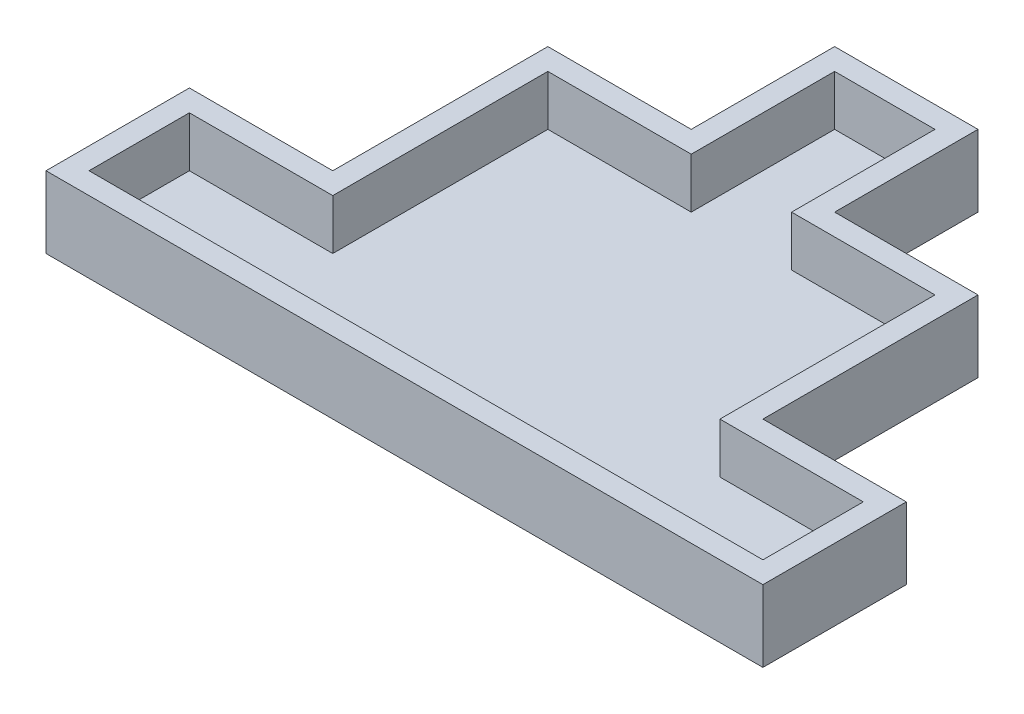
ISO-10303-21;
HEADER;
FILE_DESCRIPTION(('STEP AP214'),'2;1');
FILE_NAME('part.step','',(''),(''),'','','');
FILE_SCHEMA(('AUTOMOTIVE_DESIGN { 1 0 10303 214 1 1 1 1 }'));
ENDSEC;
DATA;
#1=APPLICATION_CONTEXT('core data for automotive mechanical design processes');
#2=APPLICATION_PROTOCOL_DEFINITION('international standard','automotive_design',2000,#1);
#3=PRODUCT_CONTEXT('',#1,'mechanical');
#4=PRODUCT('Part','Part','',(#3));
#5=PRODUCT_RELATED_PRODUCT_CATEGORY('part','',(#4));
#6=PRODUCT_DEFINITION_FORMATION('','',#4);
#7=PRODUCT_DEFINITION_CONTEXT('part definition',#1,'design');
#8=PRODUCT_DEFINITION('design','',#6,#7);
#9=PRODUCT_DEFINITION_SHAPE('','',#8);
#10=(LENGTH_UNIT() NAMED_UNIT(*) SI_UNIT(.MILLI.,.METRE.));
#11=(NAMED_UNIT(*) PLANE_ANGLE_UNIT() SI_UNIT($,.RADIAN.));
#12=(NAMED_UNIT(*) SI_UNIT($,.STERADIAN.) SOLID_ANGLE_UNIT());
#13=UNCERTAINTY_MEASURE_WITH_UNIT(LENGTH_MEASURE(1.E-05),#10,'distance_accuracy_value','');
#14=(GEOMETRIC_REPRESENTATION_CONTEXT(3) GLOBAL_UNCERTAINTY_ASSIGNED_CONTEXT((#13)) GLOBAL_UNIT_ASSIGNED_CONTEXT((#10,
#11,#12)) REPRESENTATION_CONTEXT('',''));
#15=CARTESIAN_POINT('',(0.,0.,0.));
#16=DIRECTION('',(0.,0.,1.));
#17=DIRECTION('',(1.,0.,0.));
#18=AXIS2_PLACEMENT_3D('',#15,#16,#17);
#19=CARTESIAN_POINT('',(0.,15.,0.));
#20=DIRECTION('',(0.,-1.,0.));
#21=DIRECTION('',(0.,0.,-1.));
#22=AXIS2_PLACEMENT_3D('',#19,#20,#21);
#23=PLANE('',#22);
#24=DIRECTION('',(-1.,0.,0.));
#25=VECTOR('',#24,1.);
#26=CARTESIAN_POINT('',(45.,15.,-75.));
#27=LINE('',#26,#25);
#28=CARTESIAN_POINT('',(45.,15.,-75.));
#29=VERTEX_POINT('',#28);
#30=CARTESIAN_POINT('',(15.,15.,-75.));
#31=VERTEX_POINT('',#30);
#32=EDGE_CURVE('E193',#29,#31,#27,.T.);
#33=ORIENTED_EDGE('',*,*,#32,.T.);
#34=DIRECTION('',(0.,0.,-1.));
#35=VECTOR('',#34,1.);
#36=CARTESIAN_POINT('',(15.,15.,-75.));
#37=LINE('',#36,#35);
#38=CARTESIAN_POINT('',(15.,15.,-105.));
#39=VERTEX_POINT('',#38);
#40=EDGE_CURVE('E114',#31,#39,#37,.T.);
#41=ORIENTED_EDGE('',*,*,#40,.T.);
#42=DIRECTION('',(-1.,0.,0.));
#43=VECTOR('',#42,1.);
#44=CARTESIAN_POINT('',(-15.,15.,-105.));
#45=LINE('',#44,#43);
#46=CARTESIAN_POINT('',(-15.,15.,-105.));
#47=VERTEX_POINT('',#46);
#48=EDGE_CURVE('E220',#39,#47,#45,.T.);
#49=ORIENTED_EDGE('',*,*,#48,.T.);
#50=DIRECTION('',(0.,0.,1.));
#51=VECTOR('',#50,1.);
#52=CARTESIAN_POINT('',(-15.,15.,-75.));
#53=LINE('',#52,#51);
#54=CARTESIAN_POINT('',(-15.,15.,-75.));
#55=VERTEX_POINT('',#54);
#56=EDGE_CURVE('E238',#47,#55,#53,.T.);
#57=ORIENTED_EDGE('',*,*,#56,.T.);
#58=DIRECTION('',(-1.,0.,0.));
#59=VECTOR('',#58,1.);
#60=CARTESIAN_POINT('',(-45.,15.,-75.));
#61=LINE('',#60,#59);
#62=CARTESIAN_POINT('',(-45.,15.,-75.));
#63=VERTEX_POINT('',#62);
#64=EDGE_CURVE('E235',#55,#63,#61,.T.);
#65=ORIENTED_EDGE('',*,*,#64,.T.);
#66=DIRECTION('',(0.,0.,1.));
#67=VECTOR('',#66,1.);
#68=CARTESIAN_POINT('',(-45.,15.,-30.));
#69=LINE('',#68,#67);
#70=CARTESIAN_POINT('',(-45.,15.,-30.));
#71=VERTEX_POINT('',#70);
#72=EDGE_CURVE('E237',#63,#71,#69,.T.);
#73=ORIENTED_EDGE('',*,*,#72,.T.);
#74=DIRECTION('',(-1.,0.,0.));
#75=VECTOR('',#74,1.);
#76=CARTESIAN_POINT('',(-75.,15.,-30.));
#77=LINE('',#76,#75);
#78=CARTESIAN_POINT('',(-75.,15.,-30.));
#79=VERTEX_POINT('',#78);
#80=EDGE_CURVE('E240',#71,#79,#77,.T.);
#81=ORIENTED_EDGE('',*,*,#80,.T.);
#82=DIRECTION('',(0.,0.,1.));
#83=VECTOR('',#82,1.);
#84=CARTESIAN_POINT('',(-75.,15.,0.));
#85=LINE('',#84,#83);
#86=CARTESIAN_POINT('',(-75.,15.,0.));
#87=VERTEX_POINT('',#86);
#88=EDGE_CURVE('E246',#79,#87,#85,.T.);
#89=ORIENTED_EDGE('',*,*,#88,.T.);
#90=DIRECTION('',(1.,0.,0.));
#91=VECTOR('',#90,1.);
#92=CARTESIAN_POINT('',(75.,15.,0.));
#93=LINE('',#92,#91);
#94=CARTESIAN_POINT('',(75.,15.,0.));
#95=VERTEX_POINT('',#94);
#96=EDGE_CURVE('E148',#87,#95,#93,.T.);
#97=ORIENTED_EDGE('',*,*,#96,.T.);
#98=DIRECTION('',(0.,0.,-1.));
#99=VECTOR('',#98,1.);
#100=CARTESIAN_POINT('',(75.,15.,0.));
#101=LINE('',#100,#99);
#102=CARTESIAN_POINT('',(75.,15.,-30.));
#103=VERTEX_POINT('',#102);
#104=EDGE_CURVE('E141',#95,#103,#101,.T.);
#105=ORIENTED_EDGE('',*,*,#104,.T.);
#106=DIRECTION('',(-1.,0.,0.));
#107=VECTOR('',#106,1.);
#108=CARTESIAN_POINT('',(75.,15.,-30.));
#109=LINE('',#108,#107);
#110=CARTESIAN_POINT('',(45.,15.,-30.));
#111=VERTEX_POINT('',#110);
#112=EDGE_CURVE('E145',#103,#111,#109,.T.);
#113=ORIENTED_EDGE('',*,*,#112,.T.);
#114=DIRECTION('',(0.,0.,-1.));
#115=VECTOR('',#114,1.);
#116=CARTESIAN_POINT('',(45.,15.,-30.));
#117=LINE('',#116,#115);
#118=EDGE_CURVE('E61',#111,#29,#117,.T.);
#119=ORIENTED_EDGE('',*,*,#118,.T.);
#120=EDGE_LOOP('',(#33,#41,#49,#57,#65,#73,#81,#89,#97,#105,#113,#119));
#121=FACE_BOUND('',#120,.T.);
#122=DIRECTION('',(-1.,0.,0.));
#123=VECTOR('',#122,1.);
#124=CARTESIAN_POINT('',(0.,15.,-70.5));
#125=LINE('',#124,#123);
#126=CARTESIAN_POINT('',(40.5,15.,-70.5));
#127=VERTEX_POINT('',#126);
#128=CARTESIAN_POINT('',(10.5,15.,-70.5));
#129=VERTEX_POINT('',#128);
#130=EDGE_CURVE('E296',#127,#129,#125,.T.);
#131=ORIENTED_EDGE('',*,*,#130,.F.);
#132=DIRECTION('',(0.,0.,-1.));
#133=VECTOR('',#132,1.);
#134=CARTESIAN_POINT('',(40.5,15.,0.));
#135=LINE('',#134,#133);
#136=CARTESIAN_POINT('',(40.5,15.,-25.5));
#137=VERTEX_POINT('',#136);
#138=EDGE_CURVE('E264',#137,#127,#135,.T.);
#139=ORIENTED_EDGE('',*,*,#138,.F.);
#140=DIRECTION('',(-1.,0.,0.));
#141=VECTOR('',#140,1.);
#142=CARTESIAN_POINT('',(0.,15.,-25.5));
#143=LINE('',#142,#141);
#144=CARTESIAN_POINT('',(70.5,15.,-25.5));
#145=VERTEX_POINT('',#144);
#146=EDGE_CURVE('E267',#145,#137,#143,.T.);
#147=ORIENTED_EDGE('',*,*,#146,.F.);
#148=DIRECTION('',(0.,0.,-1.));
#149=VECTOR('',#148,1.);
#150=CARTESIAN_POINT('',(70.5,15.,0.));
#151=LINE('',#150,#149);
#152=CARTESIAN_POINT('',(70.5,15.,-4.5));
#153=VERTEX_POINT('',#152);
#154=EDGE_CURVE('E269',#153,#145,#151,.T.);
#155=ORIENTED_EDGE('',*,*,#154,.F.);
#156=DIRECTION('',(1.,0.,0.));
#157=VECTOR('',#156,1.);
#158=CARTESIAN_POINT('',(0.,15.,-4.5));
#159=LINE('',#158,#157);
#160=CARTESIAN_POINT('',(-70.5,15.,-4.5));
#161=VERTEX_POINT('',#160);
#162=EDGE_CURVE('E272',#161,#153,#159,.T.);
#163=ORIENTED_EDGE('',*,*,#162,.F.);
#164=DIRECTION('',(0.,0.,1.));
#165=VECTOR('',#164,1.);
#166=CARTESIAN_POINT('',(-70.5,15.,0.));
#167=LINE('',#166,#165);
#168=CARTESIAN_POINT('',(-70.5,15.,-25.5));
#169=VERTEX_POINT('',#168);
#170=EDGE_CURVE('E275',#169,#161,#167,.T.);
#171=ORIENTED_EDGE('',*,*,#170,.F.);
#172=DIRECTION('',(-1.,0.,0.));
#173=VECTOR('',#172,1.);
#174=CARTESIAN_POINT('',(0.,15.,-25.5));
#175=LINE('',#174,#173);
#176=CARTESIAN_POINT('',(-40.5,15.,-25.5));
#177=VERTEX_POINT('',#176);
#178=EDGE_CURVE('E278',#177,#169,#175,.T.);
#179=ORIENTED_EDGE('',*,*,#178,.F.);
#180=DIRECTION('',(0.,0.,1.));
#181=VECTOR('',#180,1.);
#182=CARTESIAN_POINT('',(-40.5,15.,0.));
#183=LINE('',#182,#181);
#184=CARTESIAN_POINT('',(-40.5,15.,-70.5));
#185=VERTEX_POINT('',#184);
#186=EDGE_CURVE('E281',#185,#177,#183,.T.);
#187=ORIENTED_EDGE('',*,*,#186,.F.);
#188=DIRECTION('',(-1.,0.,0.));
#189=VECTOR('',#188,1.);
#190=CARTESIAN_POINT('',(0.,15.,-70.5));
#191=LINE('',#190,#189);
#192=CARTESIAN_POINT('',(-10.5,15.,-70.5));
#193=VERTEX_POINT('',#192);
#194=EDGE_CURVE('E284',#193,#185,#191,.T.);
#195=ORIENTED_EDGE('',*,*,#194,.F.);
#196=DIRECTION('',(0.,0.,1.));
#197=VECTOR('',#196,1.);
#198=CARTESIAN_POINT('',(-10.5,15.,0.));
#199=LINE('',#198,#197);
#200=CARTESIAN_POINT('',(-10.5,15.,-100.5));
#201=VERTEX_POINT('',#200);
#202=EDGE_CURVE('E287',#201,#193,#199,.T.);
#203=ORIENTED_EDGE('',*,*,#202,.F.);
#204=DIRECTION('',(-1.,0.,0.));
#205=VECTOR('',#204,1.);
#206=CARTESIAN_POINT('',(0.,15.,-100.5));
#207=LINE('',#206,#205);
#208=CARTESIAN_POINT('',(10.5,15.,-100.5));
#209=VERTEX_POINT('',#208);
#210=EDGE_CURVE('E290',#209,#201,#207,.T.);
#211=ORIENTED_EDGE('',*,*,#210,.F.);
#212=DIRECTION('',(0.,0.,-1.));
#213=VECTOR('',#212,1.);
#214=CARTESIAN_POINT('',(10.5,15.,0.));
#215=LINE('',#214,#213);
#216=EDGE_CURVE('E293',#129,#209,#215,.T.);
#217=ORIENTED_EDGE('',*,*,#216,.F.);
#218=EDGE_LOOP('',(#131,#139,#147,#155,#163,#171,#179,#187,#195,#203,#211,#217));
#219=FACE_BOUND('',#218,.T.);
#220=ADVANCED_FACE('F37',(#121,#219),#23,.F.);
#221=CARTESIAN_POINT('',(45.,15.,-75.));
#222=DIRECTION('',(0.,0.,1.));
#223=DIRECTION('',(1.,0.,0.));
#224=AXIS2_PLACEMENT_3D('',#221,#222,#223);
#225=PLANE('',#224);
#226=DIRECTION('',(-1.,0.,0.));
#227=VECTOR('',#226,1.);
#228=CARTESIAN_POINT('',(45.,0.,-75.));
#229=LINE('',#228,#227);
#230=CARTESIAN_POINT('',(45.,0.,-75.));
#231=VERTEX_POINT('',#230);
#232=CARTESIAN_POINT('',(15.,0.,-75.));
#233=VERTEX_POINT('',#232);
#234=EDGE_CURVE('E169',#231,#233,#229,.T.);
#235=ORIENTED_EDGE('',*,*,#234,.T.);
#236=DIRECTION('',(0.,-1.,0.));
#237=VECTOR('',#236,1.);
#238=CARTESIAN_POINT('',(15.,15.,-75.));
#239=LINE('',#238,#237);
#240=EDGE_CURVE('E11',#31,#233,#239,.T.);
#241=ORIENTED_EDGE('',*,*,#240,.F.);
#242=ORIENTED_EDGE('',*,*,#32,.F.);
#243=DIRECTION('',(0.,-1.,0.));
#244=VECTOR('',#243,1.);
#245=CARTESIAN_POINT('',(45.,15.,-75.));
#246=LINE('',#245,#244);
#247=EDGE_CURVE('E165',#29,#231,#246,.T.);
#248=ORIENTED_EDGE('',*,*,#247,.T.);
#249=EDGE_LOOP('',(#235,#241,#242,#248));
#250=FACE_BOUND('',#249,.T.);
#251=ADVANCED_FACE('F39',(#250),#225,.F.);
#252=CARTESIAN_POINT('',(15.,15.,-75.));
#253=DIRECTION('',(-1.,0.,0.));
#254=DIRECTION('',(0.,0.,1.));
#255=AXIS2_PLACEMENT_3D('',#252,#253,#254);
#256=PLANE('',#255);
#257=DIRECTION('',(0.,0.,-1.));
#258=VECTOR('',#257,1.);
#259=CARTESIAN_POINT('',(15.,0.,-75.));
#260=LINE('',#259,#258);
#261=CARTESIAN_POINT('',(15.,0.,-105.));
#262=VERTEX_POINT('',#261);
#263=EDGE_CURVE('E172',#233,#262,#260,.T.);
#264=ORIENTED_EDGE('',*,*,#263,.T.);
#265=DIRECTION('',(0.,-1.,0.));
#266=VECTOR('',#265,1.);
#267=CARTESIAN_POINT('',(15.,15.,-105.));
#268=LINE('',#267,#266);
#269=EDGE_CURVE('E45',#39,#262,#268,.T.);
#270=ORIENTED_EDGE('',*,*,#269,.F.);
#271=ORIENTED_EDGE('',*,*,#40,.F.);
#272=ORIENTED_EDGE('',*,*,#240,.T.);
#273=EDGE_LOOP('',(#264,#270,#271,#272));
#274=FACE_BOUND('',#273,.T.);
#275=ADVANCED_FACE('F455',(#274),#256,.F.);
#276=CARTESIAN_POINT('',(-15.,15.,-105.));
#277=DIRECTION('',(0.,0.,1.));
#278=DIRECTION('',(1.,0.,0.));
#279=AXIS2_PLACEMENT_3D('',#276,#277,#278);
#280=PLANE('',#279);
#281=DIRECTION('',(-1.,0.,0.));
#282=VECTOR('',#281,1.);
#283=CARTESIAN_POINT('',(-15.,0.,-105.));
#284=LINE('',#283,#282);
#285=CARTESIAN_POINT('',(-15.,0.,-105.));
#286=VERTEX_POINT('',#285);
#287=EDGE_CURVE('E175',#262,#286,#284,.T.);
#288=ORIENTED_EDGE('',*,*,#287,.T.);
#289=DIRECTION('',(0.,-1.,0.));
#290=VECTOR('',#289,1.);
#291=CARTESIAN_POINT('',(-15.,15.,-105.));
#292=LINE('',#291,#290);
#293=EDGE_CURVE('E212',#47,#286,#292,.T.);
#294=ORIENTED_EDGE('',*,*,#293,.F.);
#295=ORIENTED_EDGE('',*,*,#48,.F.);
#296=ORIENTED_EDGE('',*,*,#269,.T.);
#297=EDGE_LOOP('',(#288,#294,#295,#296));
#298=FACE_BOUND('',#297,.T.);
#299=ADVANCED_FACE('F218',(#298),#280,.F.);
#300=CARTESIAN_POINT('',(-15.,15.,-75.));
#301=DIRECTION('',(1.,0.,0.));
#302=DIRECTION('',(0.,0.,-1.));
#303=AXIS2_PLACEMENT_3D('',#300,#301,#302);
#304=PLANE('',#303);
#305=DIRECTION('',(0.,0.,1.));
#306=VECTOR('',#305,1.);
#307=CARTESIAN_POINT('',(-15.,0.,-75.));
#308=LINE('',#307,#306);
#309=CARTESIAN_POINT('',(-15.,0.,-75.));
#310=VERTEX_POINT('',#309);
#311=EDGE_CURVE('E177',#286,#310,#308,.T.);
#312=ORIENTED_EDGE('',*,*,#311,.T.);
#313=DIRECTION('',(0.,-1.,0.));
#314=VECTOR('',#313,1.);
#315=CARTESIAN_POINT('',(-15.,15.,-75.));
#316=LINE('',#315,#314);
#317=EDGE_CURVE('E209',#55,#310,#316,.T.);
#318=ORIENTED_EDGE('',*,*,#317,.F.);
#319=ORIENTED_EDGE('',*,*,#56,.F.);
#320=ORIENTED_EDGE('',*,*,#293,.T.);
#321=EDGE_LOOP('',(#312,#318,#319,#320));
#322=FACE_BOUND('',#321,.T.);
#323=ADVANCED_FACE('F229',(#322),#304,.F.);
#324=CARTESIAN_POINT('',(-45.,15.,-75.));
#325=DIRECTION('',(0.,0.,1.));
#326=DIRECTION('',(1.,0.,0.));
#327=AXIS2_PLACEMENT_3D('',#324,#325,#326);
#328=PLANE('',#327);
#329=DIRECTION('',(-1.,0.,0.));
#330=VECTOR('',#329,1.);
#331=CARTESIAN_POINT('',(-45.,0.,-75.));
#332=LINE('',#331,#330);
#333=CARTESIAN_POINT('',(-45.,0.,-75.));
#334=VERTEX_POINT('',#333);
#335=EDGE_CURVE('E179',#310,#334,#332,.T.);
#336=ORIENTED_EDGE('',*,*,#335,.T.);
#337=DIRECTION('',(0.,-1.,0.));
#338=VECTOR('',#337,1.);
#339=CARTESIAN_POINT('',(-45.,15.,-75.));
#340=LINE('',#339,#338);
#341=EDGE_CURVE('E206',#63,#334,#340,.T.);
#342=ORIENTED_EDGE('',*,*,#341,.F.);
#343=ORIENTED_EDGE('',*,*,#64,.F.);
#344=ORIENTED_EDGE('',*,*,#317,.T.);
#345=EDGE_LOOP('',(#336,#342,#343,#344));
#346=FACE_BOUND('',#345,.T.);
#347=ADVANCED_FACE('F233',(#346),#328,.F.);
#348=CARTESIAN_POINT('',(-45.,15.,-30.));
#349=DIRECTION('',(1.,0.,0.));
#350=DIRECTION('',(0.,0.,-1.));
#351=AXIS2_PLACEMENT_3D('',#348,#349,#350);
#352=PLANE('',#351);
#353=DIRECTION('',(0.,0.,1.));
#354=VECTOR('',#353,1.);
#355=CARTESIAN_POINT('',(-45.,0.,-30.));
#356=LINE('',#355,#354);
#357=CARTESIAN_POINT('',(-45.,0.,-30.));
#358=VERTEX_POINT('',#357);
#359=EDGE_CURVE('E181',#334,#358,#356,.T.);
#360=ORIENTED_EDGE('',*,*,#359,.T.);
#361=DIRECTION('',(0.,-1.,0.));
#362=VECTOR('',#361,1.);
#363=CARTESIAN_POINT('',(-45.,15.,-30.));
#364=LINE('',#363,#362);
#365=EDGE_CURVE('E203',#71,#358,#364,.T.);
#366=ORIENTED_EDGE('',*,*,#365,.F.);
#367=ORIENTED_EDGE('',*,*,#72,.F.);
#368=ORIENTED_EDGE('',*,*,#341,.T.);
#369=EDGE_LOOP('',(#360,#366,#367,#368));
#370=FACE_BOUND('',#369,.T.);
#371=ADVANCED_FACE('F473',(#370),#352,.F.);
#372=CARTESIAN_POINT('',(-75.,15.,-30.));
#373=DIRECTION('',(0.,0.,1.));
#374=DIRECTION('',(1.,0.,0.));
#375=AXIS2_PLACEMENT_3D('',#372,#373,#374);
#376=PLANE('',#375);
#377=DIRECTION('',(-1.,0.,0.));
#378=VECTOR('',#377,1.);
#379=CARTESIAN_POINT('',(-75.,0.,-30.));
#380=LINE('',#379,#378);
#381=CARTESIAN_POINT('',(-75.,0.,-30.));
#382=VERTEX_POINT('',#381);
#383=EDGE_CURVE('E183',#358,#382,#380,.T.);
#384=ORIENTED_EDGE('',*,*,#383,.T.);
#385=DIRECTION('',(0.,-1.,0.));
#386=VECTOR('',#385,1.);
#387=CARTESIAN_POINT('',(-75.,15.,-30.));
#388=LINE('',#387,#386);
#389=EDGE_CURVE('E200',#79,#382,#388,.T.);
#390=ORIENTED_EDGE('',*,*,#389,.F.);
#391=ORIENTED_EDGE('',*,*,#80,.F.);
#392=ORIENTED_EDGE('',*,*,#365,.T.);
#393=EDGE_LOOP('',(#384,#390,#391,#392));
#394=FACE_BOUND('',#393,.T.);
#395=ADVANCED_FACE('F470',(#394),#376,.F.);
#396=CARTESIAN_POINT('',(-75.,15.,0.));
#397=DIRECTION('',(1.,0.,0.));
#398=DIRECTION('',(0.,0.,-1.));
#399=AXIS2_PLACEMENT_3D('',#396,#397,#398);
#400=PLANE('',#399);
#401=DIRECTION('',(0.,0.,1.));
#402=VECTOR('',#401,1.);
#403=CARTESIAN_POINT('',(-75.,0.,0.));
#404=LINE('',#403,#402);
#405=CARTESIAN_POINT('',(-75.,0.,0.));
#406=VERTEX_POINT('',#405);
#407=EDGE_CURVE('E185',#382,#406,#404,.T.);
#408=ORIENTED_EDGE('',*,*,#407,.T.);
#409=DIRECTION('',(0.,-1.,0.));
#410=VECTOR('',#409,1.);
#411=CARTESIAN_POINT('',(-75.,15.,0.));
#412=LINE('',#411,#410);
#413=EDGE_CURVE('E197',#87,#406,#412,.T.);
#414=ORIENTED_EDGE('',*,*,#413,.F.);
#415=ORIENTED_EDGE('',*,*,#88,.F.);
#416=ORIENTED_EDGE('',*,*,#389,.T.);
#417=EDGE_LOOP('',(#408,#414,#415,#416));
#418=FACE_BOUND('',#417,.T.);
#419=ADVANCED_FACE('F252',(#418),#400,.F.);
#420=CARTESIAN_POINT('',(75.,15.,0.));
#421=DIRECTION('',(0.,0.,-1.));
#422=DIRECTION('',(-1.,0.,0.));
#423=AXIS2_PLACEMENT_3D('',#420,#421,#422);
#424=PLANE('',#423);
#425=DIRECTION('',(1.,0.,0.));
#426=VECTOR('',#425,1.);
#427=CARTESIAN_POINT('',(75.,0.,0.));
#428=LINE('',#427,#426);
#429=CARTESIAN_POINT('',(75.,0.,0.));
#430=VERTEX_POINT('',#429);
#431=EDGE_CURVE('E187',#406,#430,#428,.T.);
#432=ORIENTED_EDGE('',*,*,#431,.T.);
#433=DIRECTION('',(0.,-1.,0.));
#434=VECTOR('',#433,1.);
#435=CARTESIAN_POINT('',(75.,15.,0.));
#436=LINE('',#435,#434);
#437=EDGE_CURVE('E160',#95,#430,#436,.T.);
#438=ORIENTED_EDGE('',*,*,#437,.F.);
#439=ORIENTED_EDGE('',*,*,#96,.F.);
#440=ORIENTED_EDGE('',*,*,#413,.T.);
#441=EDGE_LOOP('',(#432,#438,#439,#440));
#442=FACE_BOUND('',#441,.T.);
#443=ADVANCED_FACE('F256',(#442),#424,.F.);
#444=CARTESIAN_POINT('',(75.,15.,0.));
#445=DIRECTION('',(-1.,0.,0.));
#446=DIRECTION('',(0.,0.,1.));
#447=AXIS2_PLACEMENT_3D('',#444,#445,#446);
#448=PLANE('',#447);
#449=DIRECTION('',(0.,0.,-1.));
#450=VECTOR('',#449,1.);
#451=CARTESIAN_POINT('',(75.,0.,0.));
#452=LINE('',#451,#450);
#453=CARTESIAN_POINT('',(75.,0.,-30.));
#454=VERTEX_POINT('',#453);
#455=EDGE_CURVE('E157',#430,#454,#452,.T.);
#456=ORIENTED_EDGE('',*,*,#455,.T.);
#457=DIRECTION('',(0.,-1.,0.));
#458=VECTOR('',#457,1.);
#459=CARTESIAN_POINT('',(75.,15.,-30.));
#460=LINE('',#459,#458);
#461=EDGE_CURVE('E154',#103,#454,#460,.T.);
#462=ORIENTED_EDGE('',*,*,#461,.F.);
#463=ORIENTED_EDGE('',*,*,#104,.F.);
#464=ORIENTED_EDGE('',*,*,#437,.T.);
#465=EDGE_LOOP('',(#456,#462,#463,#464));
#466=FACE_BOUND('',#465,.T.);
#467=ADVANCED_FACE('F155',(#466),#448,.F.);
#468=CARTESIAN_POINT('',(75.,15.,-30.));
#469=DIRECTION('',(0.,0.,1.));
#470=DIRECTION('',(1.,0.,0.));
#471=AXIS2_PLACEMENT_3D('',#468,#469,#470);
#472=PLANE('',#471);
#473=DIRECTION('',(-1.,0.,0.));
#474=VECTOR('',#473,1.);
#475=CARTESIAN_POINT('',(75.,0.,-30.));
#476=LINE('',#475,#474);
#477=CARTESIAN_POINT('',(45.,0.,-30.));
#478=VERTEX_POINT('',#477);
#479=EDGE_CURVE('E190',#454,#478,#476,.T.);
#480=ORIENTED_EDGE('',*,*,#479,.T.);
#481=DIRECTION('',(0.,-1.,0.));
#482=VECTOR('',#481,1.);
#483=CARTESIAN_POINT('',(45.,15.,-30.));
#484=LINE('',#483,#482);
#485=EDGE_CURVE('E161',#111,#478,#484,.T.);
#486=ORIENTED_EDGE('',*,*,#485,.F.);
#487=ORIENTED_EDGE('',*,*,#112,.F.);
#488=ORIENTED_EDGE('',*,*,#461,.T.);
#489=EDGE_LOOP('',(#480,#486,#487,#488));
#490=FACE_BOUND('',#489,.T.);
#491=ADVANCED_FACE('F163',(#490),#472,.F.);
#492=CARTESIAN_POINT('',(45.,15.,-30.));
#493=DIRECTION('',(-1.,0.,0.));
#494=DIRECTION('',(0.,0.,1.));
#495=AXIS2_PLACEMENT_3D('',#492,#493,#494);
#496=PLANE('',#495);
#497=DIRECTION('',(0.,0.,-1.));
#498=VECTOR('',#497,1.);
#499=CARTESIAN_POINT('',(45.,0.,-30.));
#500=LINE('',#499,#498);
#501=EDGE_CURVE('E106',#478,#231,#500,.T.);
#502=ORIENTED_EDGE('',*,*,#501,.T.);
#503=ORIENTED_EDGE('',*,*,#247,.F.);
#504=ORIENTED_EDGE('',*,*,#118,.F.);
#505=ORIENTED_EDGE('',*,*,#485,.T.);
#506=EDGE_LOOP('',(#502,#503,#504,#505));
#507=FACE_BOUND('',#506,.T.);
#508=ADVANCED_FACE('F257',(#507),#496,.F.);
#509=CARTESIAN_POINT('',(0.,0.,0.));
#510=DIRECTION('',(0.,-1.,0.));
#511=DIRECTION('',(0.,0.,-1.));
#512=AXIS2_PLACEMENT_3D('',#509,#510,#511);
#513=PLANE('',#512);
#514=ORIENTED_EDGE('',*,*,#234,.F.);
#515=ORIENTED_EDGE('',*,*,#501,.F.);
#516=ORIENTED_EDGE('',*,*,#479,.F.);
#517=ORIENTED_EDGE('',*,*,#455,.F.);
#518=ORIENTED_EDGE('',*,*,#431,.F.);
#519=ORIENTED_EDGE('',*,*,#407,.F.);
#520=ORIENTED_EDGE('',*,*,#383,.F.);
#521=ORIENTED_EDGE('',*,*,#359,.F.);
#522=ORIENTED_EDGE('',*,*,#335,.F.);
#523=ORIENTED_EDGE('',*,*,#311,.F.);
#524=ORIENTED_EDGE('',*,*,#287,.F.);
#525=ORIENTED_EDGE('',*,*,#263,.F.);
#526=EDGE_LOOP('',(#514,#515,#516,#517,#518,#519,#520,#521,#522,#523,#524,#525));
#527=FACE_BOUND('',#526,.T.);
#528=ADVANCED_FACE('F224',(#527),#513,.T.);
#529=CARTESIAN_POINT('',(45.,15.,-70.5));
#530=DIRECTION('',(0.,0.,1.));
#531=DIRECTION('',(1.,0.,0.));
#532=AXIS2_PLACEMENT_3D('',#529,#530,#531);
#533=PLANE('',#532);
#534=DIRECTION('',(-1.,0.,0.));
#535=VECTOR('',#534,1.);
#536=CARTESIAN_POINT('',(0.,4.5,-70.5));
#537=LINE('',#536,#535);
#538=CARTESIAN_POINT('',(40.5,4.5,-70.5));
#539=VERTEX_POINT('',#538);
#540=CARTESIAN_POINT('',(10.5,4.5,-70.5));
#541=VERTEX_POINT('',#540);
#542=EDGE_CURVE('E360',#539,#541,#537,.T.);
#543=ORIENTED_EDGE('',*,*,#542,.F.);
#544=DIRECTION('',(0.,-1.,0.));
#545=VECTOR('',#544,1.);
#546=CARTESIAN_POINT('',(40.5,15.,-70.5));
#547=LINE('',#546,#545);
#548=EDGE_CURVE('E266',#127,#539,#547,.T.);
#549=ORIENTED_EDGE('',*,*,#548,.F.);
#550=ORIENTED_EDGE('',*,*,#130,.T.);
#551=DIRECTION('',(0.,-1.,0.));
#552=VECTOR('',#551,1.);
#553=CARTESIAN_POINT('',(10.5,15.,-70.5));
#554=LINE('',#553,#552);
#555=EDGE_CURVE('E173',#129,#541,#554,.T.);
#556=ORIENTED_EDGE('',*,*,#555,.T.);
#557=EDGE_LOOP('',(#543,#549,#550,#556));
#558=FACE_BOUND('',#557,.T.);
#559=ADVANCED_FACE('F376',(#558),#533,.T.);
#560=CARTESIAN_POINT('',(10.5,15.,-75.));
#561=DIRECTION('',(-1.,0.,0.));
#562=DIRECTION('',(0.,0.,1.));
#563=AXIS2_PLACEMENT_3D('',#560,#561,#562);
#564=PLANE('',#563);
#565=DIRECTION('',(0.,0.,-1.));
#566=VECTOR('',#565,1.);
#567=CARTESIAN_POINT('',(10.5,4.5,0.));
#568=LINE('',#567,#566);
#569=CARTESIAN_POINT('',(10.5,4.5,-100.5));
#570=VERTEX_POINT('',#569);
#571=EDGE_CURVE('E355',#541,#570,#568,.T.);
#572=ORIENTED_EDGE('',*,*,#571,.F.);
#573=ORIENTED_EDGE('',*,*,#555,.F.);
#574=ORIENTED_EDGE('',*,*,#216,.T.);
#575=DIRECTION('',(0.,-1.,0.));
#576=VECTOR('',#575,1.);
#577=CARTESIAN_POINT('',(10.5,15.,-100.5));
#578=LINE('',#577,#576);
#579=EDGE_CURVE('E352',#209,#570,#578,.T.);
#580=ORIENTED_EDGE('',*,*,#579,.T.);
#581=EDGE_LOOP('',(#572,#573,#574,#580));
#582=FACE_BOUND('',#581,.T.);
#583=ADVANCED_FACE('F413',(#582),#564,.T.);
#584=CARTESIAN_POINT('',(-15.,15.,-100.5));
#585=DIRECTION('',(0.,0.,1.));
#586=DIRECTION('',(1.,0.,0.));
#587=AXIS2_PLACEMENT_3D('',#584,#585,#586);
#588=PLANE('',#587);
#589=DIRECTION('',(-1.,0.,0.));
#590=VECTOR('',#589,1.);
#591=CARTESIAN_POINT('',(0.,4.5,-100.5));
#592=LINE('',#591,#590);
#593=CARTESIAN_POINT('',(-10.5,4.5,-100.5));
#594=VERTEX_POINT('',#593);
#595=EDGE_CURVE('E349',#570,#594,#592,.T.);
#596=ORIENTED_EDGE('',*,*,#595,.F.);
#597=ORIENTED_EDGE('',*,*,#579,.F.);
#598=ORIENTED_EDGE('',*,*,#210,.T.);
#599=DIRECTION('',(0.,-1.,0.));
#600=VECTOR('',#599,1.);
#601=CARTESIAN_POINT('',(-10.5,15.,-100.5));
#602=LINE('',#601,#600);
#603=EDGE_CURVE('E346',#201,#594,#602,.T.);
#604=ORIENTED_EDGE('',*,*,#603,.T.);
#605=EDGE_LOOP('',(#596,#597,#598,#604));
#606=FACE_BOUND('',#605,.T.);
#607=ADVANCED_FACE('F419',(#606),#588,.T.);
#608=CARTESIAN_POINT('',(-10.5,15.,-75.));
#609=DIRECTION('',(1.,0.,0.));
#610=DIRECTION('',(0.,0.,-1.));
#611=AXIS2_PLACEMENT_3D('',#608,#609,#610);
#612=PLANE('',#611);
#613=DIRECTION('',(0.,0.,1.));
#614=VECTOR('',#613,1.);
#615=CARTESIAN_POINT('',(-10.5,4.5,0.));
#616=LINE('',#615,#614);
#617=CARTESIAN_POINT('',(-10.5,4.5,-70.5));
#618=VERTEX_POINT('',#617);
#619=EDGE_CURVE('E343',#594,#618,#616,.T.);
#620=ORIENTED_EDGE('',*,*,#619,.F.);
#621=ORIENTED_EDGE('',*,*,#603,.F.);
#622=ORIENTED_EDGE('',*,*,#202,.T.);
#623=DIRECTION('',(0.,-1.,0.));
#624=VECTOR('',#623,1.);
#625=CARTESIAN_POINT('',(-10.5,15.,-70.5));
#626=LINE('',#625,#624);
#627=EDGE_CURVE('E340',#193,#618,#626,.T.);
#628=ORIENTED_EDGE('',*,*,#627,.T.);
#629=EDGE_LOOP('',(#620,#621,#622,#628));
#630=FACE_BOUND('',#629,.T.);
#631=ADVANCED_FACE('F550',(#630),#612,.T.);
#632=CARTESIAN_POINT('',(-45.,15.,-70.5));
#633=DIRECTION('',(0.,0.,1.));
#634=DIRECTION('',(1.,0.,0.));
#635=AXIS2_PLACEMENT_3D('',#632,#633,#634);
#636=PLANE('',#635);
#637=DIRECTION('',(-1.,0.,0.));
#638=VECTOR('',#637,1.);
#639=CARTESIAN_POINT('',(0.,4.5,-70.5));
#640=LINE('',#639,#638);
#641=CARTESIAN_POINT('',(-40.5,4.5,-70.5));
#642=VERTEX_POINT('',#641);
#643=EDGE_CURVE('E337',#618,#642,#640,.T.);
#644=ORIENTED_EDGE('',*,*,#643,.F.);
#645=ORIENTED_EDGE('',*,*,#627,.F.);
#646=ORIENTED_EDGE('',*,*,#194,.T.);
#647=DIRECTION('',(0.,-1.,0.));
#648=VECTOR('',#647,1.);
#649=CARTESIAN_POINT('',(-40.5,15.,-70.5));
#650=LINE('',#649,#648);
#651=EDGE_CURVE('E334',#185,#642,#650,.T.);
#652=ORIENTED_EDGE('',*,*,#651,.T.);
#653=EDGE_LOOP('',(#644,#645,#646,#652));
#654=FACE_BOUND('',#653,.T.);
#655=ADVANCED_FACE('F557',(#654),#636,.T.);
#656=CARTESIAN_POINT('',(-40.5,15.,-30.));
#657=DIRECTION('',(1.,0.,0.));
#658=DIRECTION('',(0.,0.,-1.));
#659=AXIS2_PLACEMENT_3D('',#656,#657,#658);
#660=PLANE('',#659);
#661=DIRECTION('',(0.,0.,1.));
#662=VECTOR('',#661,1.);
#663=CARTESIAN_POINT('',(-40.5,4.5,0.));
#664=LINE('',#663,#662);
#665=CARTESIAN_POINT('',(-40.5,4.5,-25.5));
#666=VERTEX_POINT('',#665);
#667=EDGE_CURVE('E331',#642,#666,#664,.T.);
#668=ORIENTED_EDGE('',*,*,#667,.F.);
#669=ORIENTED_EDGE('',*,*,#651,.F.);
#670=ORIENTED_EDGE('',*,*,#186,.T.);
#671=DIRECTION('',(0.,-1.,0.));
#672=VECTOR('',#671,1.);
#673=CARTESIAN_POINT('',(-40.5,15.,-25.5));
#674=LINE('',#673,#672);
#675=EDGE_CURVE('E328',#177,#666,#674,.T.);
#676=ORIENTED_EDGE('',*,*,#675,.T.);
#677=EDGE_LOOP('',(#668,#669,#670,#676));
#678=FACE_BOUND('',#677,.T.);
#679=ADVANCED_FACE('F565',(#678),#660,.T.);
#680=CARTESIAN_POINT('',(-75.,15.,-25.5));
#681=DIRECTION('',(0.,0.,1.));
#682=DIRECTION('',(1.,0.,0.));
#683=AXIS2_PLACEMENT_3D('',#680,#681,#682);
#684=PLANE('',#683);
#685=DIRECTION('',(-1.,0.,0.));
#686=VECTOR('',#685,1.);
#687=CARTESIAN_POINT('',(0.,4.5,-25.5));
#688=LINE('',#687,#686);
#689=CARTESIAN_POINT('',(-70.5,4.5,-25.5));
#690=VERTEX_POINT('',#689);
#691=EDGE_CURVE('E325',#666,#690,#688,.T.);
#692=ORIENTED_EDGE('',*,*,#691,.F.);
#693=ORIENTED_EDGE('',*,*,#675,.F.);
#694=ORIENTED_EDGE('',*,*,#178,.T.);
#695=DIRECTION('',(0.,-1.,0.));
#696=VECTOR('',#695,1.);
#697=CARTESIAN_POINT('',(-70.5,15.,-25.5));
#698=LINE('',#697,#696);
#699=EDGE_CURVE('E322',#169,#690,#698,.T.);
#700=ORIENTED_EDGE('',*,*,#699,.T.);
#701=EDGE_LOOP('',(#692,#693,#694,#700));
#702=FACE_BOUND('',#701,.T.);
#703=ADVANCED_FACE('F573',(#702),#684,.T.);
#704=CARTESIAN_POINT('',(-70.5,15.,0.));
#705=DIRECTION('',(1.,0.,0.));
#706=DIRECTION('',(0.,0.,-1.));
#707=AXIS2_PLACEMENT_3D('',#704,#705,#706);
#708=PLANE('',#707);
#709=DIRECTION('',(0.,0.,1.));
#710=VECTOR('',#709,1.);
#711=CARTESIAN_POINT('',(-70.5,4.5,0.));
#712=LINE('',#711,#710);
#713=CARTESIAN_POINT('',(-70.5,4.5,-4.5));
#714=VERTEX_POINT('',#713);
#715=EDGE_CURVE('E319',#690,#714,#712,.T.);
#716=ORIENTED_EDGE('',*,*,#715,.F.);
#717=ORIENTED_EDGE('',*,*,#699,.F.);
#718=ORIENTED_EDGE('',*,*,#170,.T.);
#719=DIRECTION('',(0.,-1.,0.));
#720=VECTOR('',#719,1.);
#721=CARTESIAN_POINT('',(-70.5,15.,-4.5));
#722=LINE('',#721,#720);
#723=EDGE_CURVE('E316',#161,#714,#722,.T.);
#724=ORIENTED_EDGE('',*,*,#723,.T.);
#725=EDGE_LOOP('',(#716,#717,#718,#724));
#726=FACE_BOUND('',#725,.T.);
#727=ADVANCED_FACE('F581',(#726),#708,.T.);
#728=CARTESIAN_POINT('',(75.,15.,-4.5));
#729=DIRECTION('',(0.,0.,-1.));
#730=DIRECTION('',(-1.,0.,0.));
#731=AXIS2_PLACEMENT_3D('',#728,#729,#730);
#732=PLANE('',#731);
#733=DIRECTION('',(1.,0.,0.));
#734=VECTOR('',#733,1.);
#735=CARTESIAN_POINT('',(0.,4.5,-4.5));
#736=LINE('',#735,#734);
#737=CARTESIAN_POINT('',(70.5,4.5,-4.5));
#738=VERTEX_POINT('',#737);
#739=EDGE_CURVE('E313',#714,#738,#736,.T.);
#740=ORIENTED_EDGE('',*,*,#739,.F.);
#741=ORIENTED_EDGE('',*,*,#723,.F.);
#742=ORIENTED_EDGE('',*,*,#162,.T.);
#743=DIRECTION('',(0.,-1.,0.));
#744=VECTOR('',#743,1.);
#745=CARTESIAN_POINT('',(70.5,15.,-4.5));
#746=LINE('',#745,#744);
#747=EDGE_CURVE('E310',#153,#738,#746,.T.);
#748=ORIENTED_EDGE('',*,*,#747,.T.);
#749=EDGE_LOOP('',(#740,#741,#742,#748));
#750=FACE_BOUND('',#749,.T.);
#751=ADVANCED_FACE('F448',(#750),#732,.T.);
#752=CARTESIAN_POINT('',(70.5,15.,0.));
#753=DIRECTION('',(-1.,0.,0.));
#754=DIRECTION('',(0.,0.,1.));
#755=AXIS2_PLACEMENT_3D('',#752,#753,#754);
#756=PLANE('',#755);
#757=DIRECTION('',(0.,0.,-1.));
#758=VECTOR('',#757,1.);
#759=CARTESIAN_POINT('',(70.5,4.5,0.));
#760=LINE('',#759,#758);
#761=CARTESIAN_POINT('',(70.5,4.5,-25.5));
#762=VERTEX_POINT('',#761);
#763=EDGE_CURVE('E307',#738,#762,#760,.T.);
#764=ORIENTED_EDGE('',*,*,#763,.F.);
#765=ORIENTED_EDGE('',*,*,#747,.F.);
#766=ORIENTED_EDGE('',*,*,#154,.T.);
#767=DIRECTION('',(0.,-1.,0.));
#768=VECTOR('',#767,1.);
#769=CARTESIAN_POINT('',(70.5,15.,-25.5));
#770=LINE('',#769,#768);
#771=EDGE_CURVE('E304',#145,#762,#770,.T.);
#772=ORIENTED_EDGE('',*,*,#771,.T.);
#773=EDGE_LOOP('',(#764,#765,#766,#772));
#774=FACE_BOUND('',#773,.T.);
#775=ADVANCED_FACE('F438',(#774),#756,.T.);
#776=CARTESIAN_POINT('',(75.,15.,-25.5));
#777=DIRECTION('',(0.,0.,1.));
#778=DIRECTION('',(1.,0.,0.));
#779=AXIS2_PLACEMENT_3D('',#776,#777,#778);
#780=PLANE('',#779);
#781=DIRECTION('',(-1.,0.,0.));
#782=VECTOR('',#781,1.);
#783=CARTESIAN_POINT('',(0.,4.5,-25.5));
#784=LINE('',#783,#782);
#785=CARTESIAN_POINT('',(40.5,4.5,-25.5));
#786=VERTEX_POINT('',#785);
#787=EDGE_CURVE('E302',#762,#786,#784,.T.);
#788=ORIENTED_EDGE('',*,*,#787,.F.);
#789=ORIENTED_EDGE('',*,*,#771,.F.);
#790=ORIENTED_EDGE('',*,*,#146,.T.);
#791=DIRECTION('',(0.,-1.,0.));
#792=VECTOR('',#791,1.);
#793=CARTESIAN_POINT('',(40.5,15.,-25.5));
#794=LINE('',#793,#792);
#795=EDGE_CURVE('E52',#137,#786,#794,.T.);
#796=ORIENTED_EDGE('',*,*,#795,.T.);
#797=EDGE_LOOP('',(#788,#789,#790,#796));
#798=FACE_BOUND('',#797,.T.);
#799=ADVANCED_FACE('F440',(#798),#780,.T.);
#800=CARTESIAN_POINT('',(40.5,15.,-30.));
#801=DIRECTION('',(-1.,0.,0.));
#802=DIRECTION('',(0.,0.,1.));
#803=AXIS2_PLACEMENT_3D('',#800,#801,#802);
#804=PLANE('',#803);
#805=DIRECTION('',(0.,0.,-1.));
#806=VECTOR('',#805,1.);
#807=CARTESIAN_POINT('',(40.5,4.5,0.));
#808=LINE('',#807,#806);
#809=EDGE_CURVE('E299',#786,#539,#808,.T.);
#810=ORIENTED_EDGE('',*,*,#809,.F.);
#811=ORIENTED_EDGE('',*,*,#795,.F.);
#812=ORIENTED_EDGE('',*,*,#138,.T.);
#813=ORIENTED_EDGE('',*,*,#548,.T.);
#814=EDGE_LOOP('',(#810,#811,#812,#813));
#815=FACE_BOUND('',#814,.T.);
#816=ADVANCED_FACE('F408',(#815),#804,.T.);
#817=CARTESIAN_POINT('',(0.,4.5,0.));
#818=DIRECTION('',(0.,-1.,0.));
#819=DIRECTION('',(0.,0.,-1.));
#820=AXIS2_PLACEMENT_3D('',#817,#818,#819);
#821=PLANE('',#820);
#822=ORIENTED_EDGE('',*,*,#542,.T.);
#823=ORIENTED_EDGE('',*,*,#571,.T.);
#824=ORIENTED_EDGE('',*,*,#595,.T.);
#825=ORIENTED_EDGE('',*,*,#619,.T.);
#826=ORIENTED_EDGE('',*,*,#643,.T.);
#827=ORIENTED_EDGE('',*,*,#667,.T.);
#828=ORIENTED_EDGE('',*,*,#691,.T.);
#829=ORIENTED_EDGE('',*,*,#715,.T.);
#830=ORIENTED_EDGE('',*,*,#739,.T.);
#831=ORIENTED_EDGE('',*,*,#763,.T.);
#832=ORIENTED_EDGE('',*,*,#787,.T.);
#833=ORIENTED_EDGE('',*,*,#809,.T.);
#834=EDGE_LOOP('',(#822,#823,#824,#825,#826,#827,#828,#829,#830,#831,#832,#833));
#835=FACE_BOUND('',#834,.T.);
#836=ADVANCED_FACE('F369',(#835),#821,.F.);
#837=CLOSED_SHELL('',(#220,#251,#275,#299,#323,#347,#371,#395,#419,#443,#467,#491,#508,#528,
#559,#583,#607,#631,#655,#679,#703,#727,#751,#775,#799,#816,#836));
#838=MANIFOLD_SOLID_BREP('B2',#837);
#839=ADVANCED_BREP_SHAPE_REPRESENTATION('',(#18,#838),#14);
#840=SHAPE_DEFINITION_REPRESENTATION(#9,#839);
ENDSEC;
END-ISO-10303-21;
